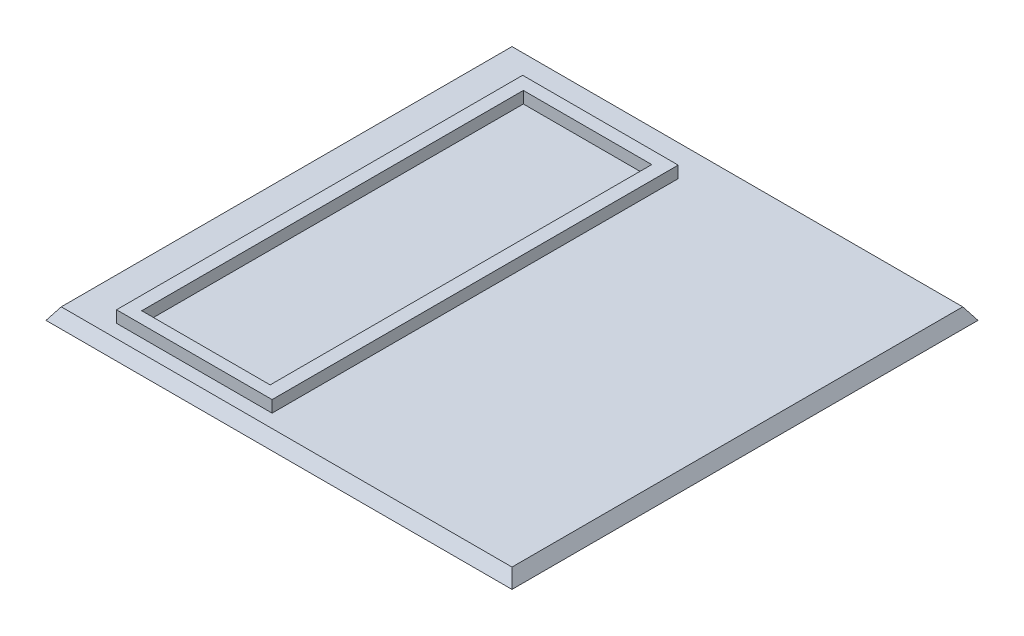
ISO-10303-21;
HEADER;
FILE_DESCRIPTION(('STEP AP214'),'2;1');
FILE_NAME('part.step','',(''),(''),'','','');
FILE_SCHEMA(('AUTOMOTIVE_DESIGN { 1 0 10303 214 1 1 1 1 }'));
ENDSEC;
DATA;
#1=APPLICATION_CONTEXT('core data for automotive mechanical design processes');
#2=APPLICATION_PROTOCOL_DEFINITION('international standard','automotive_design',2000,#1);
#3=PRODUCT_CONTEXT('',#1,'mechanical');
#4=PRODUCT('Part','Part','',(#3));
#5=PRODUCT_RELATED_PRODUCT_CATEGORY('part','',(#4));
#6=PRODUCT_DEFINITION_FORMATION('','',#4);
#7=PRODUCT_DEFINITION_CONTEXT('part definition',#1,'design');
#8=PRODUCT_DEFINITION('design','',#6,#7);
#9=PRODUCT_DEFINITION_SHAPE('','',#8);
#10=(LENGTH_UNIT() NAMED_UNIT(*) SI_UNIT(.MILLI.,.METRE.));
#11=(NAMED_UNIT(*) PLANE_ANGLE_UNIT() SI_UNIT($,.RADIAN.));
#12=(NAMED_UNIT(*) SI_UNIT($,.STERADIAN.) SOLID_ANGLE_UNIT());
#13=UNCERTAINTY_MEASURE_WITH_UNIT(LENGTH_MEASURE(1.E-05),#10,'distance_accuracy_value','');
#14=(GEOMETRIC_REPRESENTATION_CONTEXT(3) GLOBAL_UNCERTAINTY_ASSIGNED_CONTEXT((#13)) GLOBAL_UNIT_ASSIGNED_CONTEXT((#10,
#11,#12)) REPRESENTATION_CONTEXT('',''));
#15=CARTESIAN_POINT('',(0.,0.,0.));
#16=DIRECTION('',(0.,0.,1.));
#17=DIRECTION('',(1.,0.,0.));
#18=AXIS2_PLACEMENT_3D('',#15,#16,#17);
#19=CARTESIAN_POINT('',(-45.5658075441117,0.,-132.437465749095));
#20=DIRECTION('',(-0.838670567945423,0.544639035015028,0.));
#21=DIRECTION('',(-0.544639035015028,-0.838670567945423,0.));
#22=AXIS2_PLACEMENT_3D('',#19,#20,#21);
#23=PLANE('',#22);
#24=DIRECTION('',(0.,0.,1.));
#25=VECTOR('',#24,1.);
#26=CARTESIAN_POINT('',(-45.5658075441117,0.,-132.437465749095));
#27=LINE('',#26,#25);
#28=CARTESIAN_POINT('',(-45.5658075441117,0.,-132.437465749095));
#29=VERTEX_POINT('',#28);
#30=CARTESIAN_POINT('',(-45.5658075441117,0.,69.1750342509052));
#31=VERTEX_POINT('',#30);
#32=EDGE_CURVE('E230',#29,#31,#27,.T.);
#33=ORIENTED_EDGE('',*,*,#32,.T.);
#34=DIRECTION('',(-0.47830007689565,-0.736517530601431,0.47830007689565));
#35=VECTOR('',#34,1.);
#36=CARTESIAN_POINT('',(-45.5658075441117,0.,69.1750342509052));
#37=LINE('',#36,#35);
#38=CARTESIAN_POINT('',(-42.2668169706683,5.08,65.8760436774619));
#39=VERTEX_POINT('',#38);
#40=EDGE_CURVE('E12',#39,#31,#37,.T.);
#41=ORIENTED_EDGE('',*,*,#40,.F.);
#42=DIRECTION('',(0.,0.,-1.));
#43=VECTOR('',#42,1.);
#44=CARTESIAN_POINT('',(-42.2668169706683,5.08,-132.437465749095));
#45=LINE('',#44,#43);
#46=CARTESIAN_POINT('',(-42.2668169706683,5.08,-129.138475175651));
#47=VERTEX_POINT('',#46);
#48=EDGE_CURVE('E242',#47,#39,#45,.F.);
#49=ORIENTED_EDGE('',*,*,#48,.F.);
#50=DIRECTION('',(-0.47830007689565,-0.736517530601431,-0.47830007689565));
#51=VECTOR('',#50,1.);
#52=CARTESIAN_POINT('',(-45.5658075441117,0.,-132.437465749095));
#53=LINE('',#52,#51);
#54=EDGE_CURVE('E244',#47,#29,#53,.T.);
#55=ORIENTED_EDGE('',*,*,#54,.T.);
#56=EDGE_LOOP('',(#33,#41,#49,#55));
#57=FACE_BOUND('',#56,.T.);
#58=ADVANCED_FACE('F75',(#57),#23,.T.);
#59=CARTESIAN_POINT('',(-45.5658075441117,0.,69.1750342509052));
#60=DIRECTION('',(0.,0.544639035015028,0.838670567945423));
#61=DIRECTION('',(0.,-0.838670567945423,0.544639035015028));
#62=AXIS2_PLACEMENT_3D('',#59,#60,#61);
#63=PLANE('',#62);
#64=DIRECTION('',(1.,0.,0.));
#65=VECTOR('',#64,1.);
#66=CARTESIAN_POINT('',(-45.5658075441117,0.,69.1750342509052));
#67=LINE('',#66,#65);
#68=CARTESIAN_POINT('',(156.046692455888,0.,69.1750342509052));
#69=VERTEX_POINT('',#68);
#70=EDGE_CURVE('E237',#31,#69,#67,.T.);
#71=ORIENTED_EDGE('',*,*,#70,.T.);
#72=DIRECTION('',(0.47830007689565,-0.736517530601431,0.47830007689565));
#73=VECTOR('',#72,1.);
#74=CARTESIAN_POINT('',(109.923606565473,71.0233239856605,23.0519483604903));
#75=LINE('',#74,#73);
#76=CARTESIAN_POINT('',(152.747701882445,5.08,65.8760436774619));
#77=VERTEX_POINT('',#76);
#78=EDGE_CURVE('E84',#77,#69,#75,.T.);
#79=ORIENTED_EDGE('',*,*,#78,.F.);
#80=DIRECTION('',(-1.,0.,0.));
#81=VECTOR('',#80,1.);
#82=CARTESIAN_POINT('',(-45.5658075441117,5.08,65.8760436774619));
#83=LINE('',#82,#81);
#84=EDGE_CURVE('E254',#39,#77,#83,.F.);
#85=ORIENTED_EDGE('',*,*,#84,.F.);
#86=ORIENTED_EDGE('',*,*,#40,.T.);
#87=EDGE_LOOP('',(#71,#79,#85,#86));
#88=FACE_BOUND('',#87,.T.);
#89=ADVANCED_FACE('F77',(#88),#63,.T.);
#90=CARTESIAN_POINT('',(156.046692455888,0.,-132.437465749095));
#91=DIRECTION('',(0.838670567945423,0.544639035015028,0.));
#92=DIRECTION('',(-0.544639035015028,0.838670567945423,0.));
#93=AXIS2_PLACEMENT_3D('',#90,#91,#92);
#94=PLANE('',#93);
#95=DIRECTION('',(0.,0.,-1.));
#96=VECTOR('',#95,1.);
#97=CARTESIAN_POINT('',(156.046692455888,0.,-132.437465749095));
#98=LINE('',#97,#96);
#99=CARTESIAN_POINT('',(156.046692455888,0.,-132.437465749095));
#100=VERTEX_POINT('',#99);
#101=EDGE_CURVE('E239',#69,#100,#98,.T.);
#102=ORIENTED_EDGE('',*,*,#101,.T.);
#103=DIRECTION('',(0.47830007689565,-0.736517530601431,-0.47830007689565));
#104=VECTOR('',#103,1.);
#105=CARTESIAN_POINT('',(109.923606565473,71.0233239856605,-86.3143798586798));
#106=LINE('',#105,#104);
#107=CARTESIAN_POINT('',(152.747701882445,5.08,-129.138475175651));
#108=VERTEX_POINT('',#107);
#109=EDGE_CURVE('E247',#108,#100,#106,.T.);
#110=ORIENTED_EDGE('',*,*,#109,.F.);
#111=DIRECTION('',(0.,0.,1.));
#112=VECTOR('',#111,1.);
#113=CARTESIAN_POINT('',(152.747701882445,5.08,-132.437465749095));
#114=LINE('',#113,#112);
#115=EDGE_CURVE('E255',#77,#108,#114,.F.);
#116=ORIENTED_EDGE('',*,*,#115,.F.);
#117=ORIENTED_EDGE('',*,*,#78,.T.);
#118=EDGE_LOOP('',(#102,#110,#116,#117));
#119=FACE_BOUND('',#118,.T.);
#120=ADVANCED_FACE('F273',(#119),#94,.T.);
#121=CARTESIAN_POINT('',(-45.5658075441117,0.,-132.437465749095));
#122=DIRECTION('',(0.,0.544639035015028,-0.838670567945423));
#123=DIRECTION('',(0.,0.838670567945423,0.544639035015028));
#124=AXIS2_PLACEMENT_3D('',#121,#122,#123);
#125=PLANE('',#124);
#126=DIRECTION('',(-1.,0.,0.));
#127=VECTOR('',#126,1.);
#128=CARTESIAN_POINT('',(-45.5658075441117,0.,-132.437465749095));
#129=LINE('',#128,#127);
#130=EDGE_CURVE('E241',#100,#29,#129,.T.);
#131=ORIENTED_EDGE('',*,*,#130,.T.);
#132=ORIENTED_EDGE('',*,*,#54,.F.);
#133=DIRECTION('',(1.,0.,0.));
#134=VECTOR('',#133,1.);
#135=CARTESIAN_POINT('',(-45.5658075441117,5.08,-129.138475175651));
#136=LINE('',#135,#134);
#137=EDGE_CURVE('E79',#108,#47,#136,.F.);
#138=ORIENTED_EDGE('',*,*,#137,.F.);
#139=ORIENTED_EDGE('',*,*,#109,.T.);
#140=EDGE_LOOP('',(#131,#132,#138,#139));
#141=FACE_BOUND('',#140,.T.);
#142=ADVANCED_FACE('F265',(#141),#125,.T.);
#143=CARTESIAN_POINT('',(0.,5.08,0.));
#144=DIRECTION('',(0.,1.,0.));
#145=DIRECTION('',(0.,0.,1.));
#146=AXIS2_PLACEMENT_3D('',#143,#144,#145);
#147=PLANE('',#146);
#148=DIRECTION('',(1.,0.,0.));
#149=VECTOR('',#148,1.);
#150=CARTESIAN_POINT('',(0.,5.08,-115.607695066937));
#151=LINE('',#150,#149);
#152=CARTESIAN_POINT('',(-24.13,5.08,-115.607695066937));
#153=VERTEX_POINT('',#152);
#154=CARTESIAN_POINT('',(43.18,5.08,-115.607695066937));
#155=VERTEX_POINT('',#154);
#156=EDGE_CURVE('E201',#153,#155,#151,.T.);
#157=ORIENTED_EDGE('',*,*,#156,.T.);
#158=DIRECTION('',(0.,0.,1.));
#159=VECTOR('',#158,1.);
#160=CARTESIAN_POINT('',(43.18,5.08,0.));
#161=LINE('',#160,#159);
#162=CARTESIAN_POINT('',(43.18,5.08,60.1010530598857));
#163=VERTEX_POINT('',#162);
#164=EDGE_CURVE('E170',#155,#163,#161,.T.);
#165=ORIENTED_EDGE('',*,*,#164,.T.);
#166=DIRECTION('',(1.,0.,0.));
#167=VECTOR('',#166,1.);
#168=CARTESIAN_POINT('',(0.,5.08,60.1010530598857));
#169=LINE('',#168,#167);
#170=CARTESIAN_POINT('',(-24.13,5.08,60.1010530598857));
#171=VERTEX_POINT('',#170);
#172=EDGE_CURVE('E97',#171,#163,#169,.T.);
#173=ORIENTED_EDGE('',*,*,#172,.F.);
#174=DIRECTION('',(0.,0.,1.));
#175=VECTOR('',#174,1.);
#176=CARTESIAN_POINT('',(-24.13,5.08,0.));
#177=LINE('',#176,#175);
#178=EDGE_CURVE('E92',#153,#171,#177,.T.);
#179=ORIENTED_EDGE('',*,*,#178,.F.);
#180=EDGE_LOOP('',(#157,#165,#173,#179));
#181=FACE_BOUND('',#180,.T.);
#182=ORIENTED_EDGE('',*,*,#48,.T.);
#183=ORIENTED_EDGE('',*,*,#84,.T.);
#184=ORIENTED_EDGE('',*,*,#115,.T.);
#185=ORIENTED_EDGE('',*,*,#137,.T.);
#186=EDGE_LOOP('',(#182,#183,#184,#185));
#187=FACE_BOUND('',#186,.T.);
#188=ADVANCED_FACE('F261',(#181,#187),#147,.T.);
#189=CARTESIAN_POINT('',(0.,0.,0.));
#190=DIRECTION('',(0.,1.,0.));
#191=DIRECTION('',(0.,0.,1.));
#192=AXIS2_PLACEMENT_3D('',#189,#190,#191);
#193=PLANE('',#192);
#194=ORIENTED_EDGE('',*,*,#32,.F.);
#195=ORIENTED_EDGE('',*,*,#130,.F.);
#196=ORIENTED_EDGE('',*,*,#101,.F.);
#197=ORIENTED_EDGE('',*,*,#70,.F.);
#198=EDGE_LOOP('',(#194,#195,#196,#197));
#199=FACE_BOUND('',#198,.T.);
#200=ADVANCED_FACE('F275',(#199),#193,.F.);
#201=CARTESIAN_POINT('',(0.,10.16,-115.607695066937));
#202=DIRECTION('',(0.,0.,-1.));
#203=DIRECTION('',(-1.,0.,0.));
#204=AXIS2_PLACEMENT_3D('',#201,#202,#203);
#205=PLANE('',#204);
#206=ORIENTED_EDGE('',*,*,#156,.F.);
#207=DIRECTION('',(0.,-1.,0.));
#208=VECTOR('',#207,1.);
#209=CARTESIAN_POINT('',(-24.13,10.16,-115.607695066937));
#210=LINE('',#209,#208);
#211=CARTESIAN_POINT('',(-24.13,10.16,-115.607695066937));
#212=VERTEX_POINT('',#211);
#213=EDGE_CURVE('E175',#212,#153,#210,.T.);
#214=ORIENTED_EDGE('',*,*,#213,.F.);
#215=DIRECTION('',(1.,0.,0.));
#216=VECTOR('',#215,1.);
#217=CARTESIAN_POINT('',(0.,10.16,-115.607695066937));
#218=LINE('',#217,#216);
#219=CARTESIAN_POINT('',(43.18,10.16,-115.607695066937));
#220=VERTEX_POINT('',#219);
#221=EDGE_CURVE('E180',#212,#220,#218,.T.);
#222=ORIENTED_EDGE('',*,*,#221,.T.);
#223=DIRECTION('',(0.,-1.,0.));
#224=VECTOR('',#223,1.);
#225=CARTESIAN_POINT('',(43.18,10.16,-115.607695066937));
#226=LINE('',#225,#224);
#227=EDGE_CURVE('E165',#220,#155,#226,.T.);
#228=ORIENTED_EDGE('',*,*,#227,.T.);
#229=EDGE_LOOP('',(#206,#214,#222,#228));
#230=FACE_BOUND('',#229,.T.);
#231=ADVANCED_FACE('F185',(#230),#205,.T.);
#232=CARTESIAN_POINT('',(0.,10.16,-110.080326261895));
#233=DIRECTION('',(0.,0.,-1.));
#234=DIRECTION('',(-1.,0.,0.));
#235=AXIS2_PLACEMENT_3D('',#232,#233,#234);
#236=PLANE('',#235);
#237=DIRECTION('',(1.,0.,0.));
#238=VECTOR('',#237,1.);
#239=CARTESIAN_POINT('',(0.,10.16,-110.080326261895));
#240=LINE('',#239,#238);
#241=CARTESIAN_POINT('',(-18.3058372014575,10.16,-110.080326261895));
#242=VERTEX_POINT('',#241);
#243=CARTESIAN_POINT('',(37.2566627985425,10.16,-110.080326261895));
#244=VERTEX_POINT('',#243);
#245=EDGE_CURVE('E189',#242,#244,#240,.T.);
#246=ORIENTED_EDGE('',*,*,#245,.F.);
#247=DIRECTION('',(0.,-1.,0.));
#248=VECTOR('',#247,1.);
#249=CARTESIAN_POINT('',(-18.3058372014575,10.16,-110.080326261895));
#250=LINE('',#249,#248);
#251=CARTESIAN_POINT('',(-18.3058372014575,5.08,-110.080326261895));
#252=VERTEX_POINT('',#251);
#253=EDGE_CURVE('E227',#242,#252,#250,.T.);
#254=ORIENTED_EDGE('',*,*,#253,.T.);
#255=DIRECTION('',(1.,0.,0.));
#256=VECTOR('',#255,1.);
#257=CARTESIAN_POINT('',(0.,5.08,-110.080326261895));
#258=LINE('',#257,#256);
#259=CARTESIAN_POINT('',(37.2566627985425,5.08,-110.080326261895));
#260=VERTEX_POINT('',#259);
#261=EDGE_CURVE('E204',#252,#260,#258,.T.);
#262=ORIENTED_EDGE('',*,*,#261,.T.);
#263=DIRECTION('',(0.,-1.,0.));
#264=VECTOR('',#263,1.);
#265=CARTESIAN_POINT('',(37.2566627985425,10.16,-110.080326261895));
#266=LINE('',#265,#264);
#267=EDGE_CURVE('E222',#244,#260,#266,.T.);
#268=ORIENTED_EDGE('',*,*,#267,.F.);
#269=EDGE_LOOP('',(#246,#254,#262,#268));
#270=FACE_BOUND('',#269,.T.);
#271=ADVANCED_FACE('F283',(#270),#236,.F.);
#272=CARTESIAN_POINT('',(37.2566627985425,10.16,0.));
#273=DIRECTION('',(1.,0.,0.));
#274=DIRECTION('',(0.,0.,-1.));
#275=AXIS2_PLACEMENT_3D('',#272,#273,#274);
#276=PLANE('',#275);
#277=DIRECTION('',(0.,0.,1.));
#278=VECTOR('',#277,1.);
#279=CARTESIAN_POINT('',(37.2566627985425,5.08,0.));
#280=LINE('',#279,#278);
#281=CARTESIAN_POINT('',(37.2566627985425,5.08,55.0196737381054));
#282=VERTEX_POINT('',#281);
#283=EDGE_CURVE('E207',#260,#282,#280,.T.);
#284=ORIENTED_EDGE('',*,*,#283,.T.);
#285=DIRECTION('',(0.,-1.,0.));
#286=VECTOR('',#285,1.);
#287=CARTESIAN_POINT('',(37.2566627985425,10.16,55.0196737381054));
#288=LINE('',#287,#286);
#289=CARTESIAN_POINT('',(37.2566627985425,10.16,55.0196737381054));
#290=VERTEX_POINT('',#289);
#291=EDGE_CURVE('E219',#290,#282,#288,.T.);
#292=ORIENTED_EDGE('',*,*,#291,.F.);
#293=DIRECTION('',(0.,0.,1.));
#294=VECTOR('',#293,1.);
#295=CARTESIAN_POINT('',(37.2566627985425,10.16,0.));
#296=LINE('',#295,#294);
#297=EDGE_CURVE('E193',#244,#290,#296,.T.);
#298=ORIENTED_EDGE('',*,*,#297,.F.);
#299=ORIENTED_EDGE('',*,*,#267,.T.);
#300=EDGE_LOOP('',(#284,#292,#298,#299));
#301=FACE_BOUND('',#300,.T.);
#302=ADVANCED_FACE('F331',(#301),#276,.F.);
#303=CARTESIAN_POINT('',(-1.28905603618974E-13,10.16,55.0196737381053));
#304=DIRECTION('',(0.,0.,1.));
#305=DIRECTION('',(1.,0.,0.));
#306=AXIS2_PLACEMENT_3D('',#303,#304,#305);
#307=PLANE('',#306);
#308=DIRECTION('',(-1.,0.,0.));
#309=VECTOR('',#308,1.);
#310=CARTESIAN_POINT('',(-1.28905603618974E-13,5.08,55.0196737381053));
#311=LINE('',#310,#309);
#312=CARTESIAN_POINT('',(-18.3058372014575,5.08,55.0196737381054));
#313=VERTEX_POINT('',#312);
#314=EDGE_CURVE('E210',#282,#313,#311,.T.);
#315=ORIENTED_EDGE('',*,*,#314,.T.);
#316=DIRECTION('',(0.,1.,0.));
#317=VECTOR('',#316,1.);
#318=CARTESIAN_POINT('',(-18.3058372014575,10.16,55.0196737381053));
#319=LINE('',#318,#317);
#320=CARTESIAN_POINT('',(-18.3058372014575,10.16,55.0196737381053));
#321=VERTEX_POINT('',#320);
#322=EDGE_CURVE('E174',#313,#321,#319,.T.);
#323=ORIENTED_EDGE('',*,*,#322,.T.);
#324=DIRECTION('',(-1.,0.,0.));
#325=VECTOR('',#324,1.);
#326=CARTESIAN_POINT('',(-1.28905603618974E-13,10.16,55.0196737381053));
#327=LINE('',#326,#325);
#328=EDGE_CURVE('E195',#290,#321,#327,.T.);
#329=ORIENTED_EDGE('',*,*,#328,.F.);
#330=ORIENTED_EDGE('',*,*,#291,.T.);
#331=EDGE_LOOP('',(#315,#323,#329,#330));
#332=FACE_BOUND('',#331,.T.);
#333=ADVANCED_FACE('F343',(#332),#307,.F.);
#334=CARTESIAN_POINT('',(-24.13,10.16,0.));
#335=DIRECTION('',(1.,0.,0.));
#336=DIRECTION('',(0.,0.,-1.));
#337=AXIS2_PLACEMENT_3D('',#334,#335,#336);
#338=PLANE('',#337);
#339=ORIENTED_EDGE('',*,*,#178,.T.);
#340=DIRECTION('',(0.,-1.,0.));
#341=VECTOR('',#340,1.);
#342=CARTESIAN_POINT('',(-24.13,10.16,60.1010530598857));
#343=LINE('',#342,#341);
#344=CARTESIAN_POINT('',(-24.13,10.16,60.1010530598857));
#345=VERTEX_POINT('',#344);
#346=EDGE_CURVE('E216',#345,#171,#343,.T.);
#347=ORIENTED_EDGE('',*,*,#346,.F.);
#348=DIRECTION('',(0.,0.,1.));
#349=VECTOR('',#348,1.);
#350=CARTESIAN_POINT('',(-24.13,10.16,0.));
#351=LINE('',#350,#349);
#352=EDGE_CURVE('E187',#212,#345,#351,.T.);
#353=ORIENTED_EDGE('',*,*,#352,.F.);
#354=ORIENTED_EDGE('',*,*,#213,.T.);
#355=EDGE_LOOP('',(#339,#347,#353,#354));
#356=FACE_BOUND('',#355,.T.);
#357=ADVANCED_FACE('F354',(#356),#338,.F.);
#358=CARTESIAN_POINT('',(0.,10.16,60.1010530598857));
#359=DIRECTION('',(0.,0.,-1.));
#360=DIRECTION('',(-1.,0.,0.));
#361=AXIS2_PLACEMENT_3D('',#358,#359,#360);
#362=PLANE('',#361);
#363=ORIENTED_EDGE('',*,*,#172,.T.);
#364=DIRECTION('',(0.,-1.,0.));
#365=VECTOR('',#364,1.);
#366=CARTESIAN_POINT('',(43.18,10.16,60.1010530598857));
#367=LINE('',#366,#365);
#368=CARTESIAN_POINT('',(43.18,10.16,60.1010530598857));
#369=VERTEX_POINT('',#368);
#370=EDGE_CURVE('E199',#369,#163,#367,.T.);
#371=ORIENTED_EDGE('',*,*,#370,.F.);
#372=DIRECTION('',(1.,0.,0.));
#373=VECTOR('',#372,1.);
#374=CARTESIAN_POINT('',(0.,10.16,60.1010530598857));
#375=LINE('',#374,#373);
#376=EDGE_CURVE('E182',#345,#369,#375,.T.);
#377=ORIENTED_EDGE('',*,*,#376,.F.);
#378=ORIENTED_EDGE('',*,*,#346,.T.);
#379=EDGE_LOOP('',(#363,#371,#377,#378));
#380=FACE_BOUND('',#379,.T.);
#381=ADVANCED_FACE('F366',(#380),#362,.F.);
#382=CARTESIAN_POINT('',(43.18,10.16,0.));
#383=DIRECTION('',(1.,0.,0.));
#384=DIRECTION('',(0.,0.,-1.));
#385=AXIS2_PLACEMENT_3D('',#382,#383,#384);
#386=PLANE('',#385);
#387=ORIENTED_EDGE('',*,*,#164,.F.);
#388=ORIENTED_EDGE('',*,*,#227,.F.);
#389=DIRECTION('',(0.,0.,1.));
#390=VECTOR('',#389,1.);
#391=CARTESIAN_POINT('',(43.18,10.16,0.));
#392=LINE('',#391,#390);
#393=EDGE_CURVE('E169',#220,#369,#392,.T.);
#394=ORIENTED_EDGE('',*,*,#393,.T.);
#395=ORIENTED_EDGE('',*,*,#370,.T.);
#396=EDGE_LOOP('',(#387,#388,#394,#395));
#397=FACE_BOUND('',#396,.T.);
#398=ADVANCED_FACE('F167',(#397),#386,.T.);
#399=CARTESIAN_POINT('',(0.,10.16,0.));
#400=DIRECTION('',(0.,1.,0.));
#401=DIRECTION('',(0.,0.,1.));
#402=AXIS2_PLACEMENT_3D('',#399,#400,#401);
#403=PLANE('',#402);
#404=DIRECTION('',(0.,0.,1.));
#405=VECTOR('',#404,1.);
#406=CARTESIAN_POINT('',(-18.3058372014575,10.16,-110.080326261895));
#407=LINE('',#406,#405);
#408=EDGE_CURVE('E202',#242,#321,#407,.T.);
#409=ORIENTED_EDGE('',*,*,#408,.F.);
#410=ORIENTED_EDGE('',*,*,#245,.T.);
#411=ORIENTED_EDGE('',*,*,#297,.T.);
#412=ORIENTED_EDGE('',*,*,#328,.T.);
#413=EDGE_LOOP('',(#409,#410,#411,#412));
#414=FACE_BOUND('',#413,.T.);
#415=ORIENTED_EDGE('',*,*,#393,.F.);
#416=ORIENTED_EDGE('',*,*,#221,.F.);
#417=ORIENTED_EDGE('',*,*,#352,.T.);
#418=ORIENTED_EDGE('',*,*,#376,.T.);
#419=EDGE_LOOP('',(#415,#416,#417,#418));
#420=FACE_BOUND('',#419,.T.);
#421=ADVANCED_FACE('F179',(#414,#420),#403,.T.);
#422=CARTESIAN_POINT('',(-18.3058372014575,10.16,-110.080326261895));
#423=DIRECTION('',(1.,0.,0.));
#424=DIRECTION('',(0.,0.,-1.));
#425=AXIS2_PLACEMENT_3D('',#422,#423,#424);
#426=PLANE('',#425);
#427=DIRECTION('',(0.,0.,1.));
#428=VECTOR('',#427,1.);
#429=CARTESIAN_POINT('',(-18.3058372014575,5.08,-110.080326261895));
#430=LINE('',#429,#428);
#431=EDGE_CURVE('E233',#252,#313,#430,.T.);
#432=ORIENTED_EDGE('',*,*,#431,.F.);
#433=ORIENTED_EDGE('',*,*,#253,.F.);
#434=ORIENTED_EDGE('',*,*,#408,.T.);
#435=ORIENTED_EDGE('',*,*,#322,.F.);
#436=EDGE_LOOP('',(#432,#433,#434,#435));
#437=FACE_BOUND('',#436,.T.);
#438=ADVANCED_FACE('F278',(#437),#426,.T.);
#439=ORIENTED_EDGE('',*,*,#283,.F.);
#440=ORIENTED_EDGE('',*,*,#261,.F.);
#441=ORIENTED_EDGE('',*,*,#431,.T.);
#442=ORIENTED_EDGE('',*,*,#314,.F.);
#443=EDGE_LOOP('',(#439,#440,#441,#442));
#444=FACE_BOUND('',#443,.T.);
#445=ADVANCED_FACE('F286',(#444),#147,.T.);
#446=CLOSED_SHELL('',(#58,#89,#120,#142,#188,#200,#231,#271,#302,#333,#357,#381,#398,#421,#438,#445));
#447=MANIFOLD_SOLID_BREP('B2',#446);
#448=ADVANCED_BREP_SHAPE_REPRESENTATION('',(#18,#447),#14);
#449=SHAPE_DEFINITION_REPRESENTATION(#9,#448);
ENDSEC;
END-ISO-10303-21;
